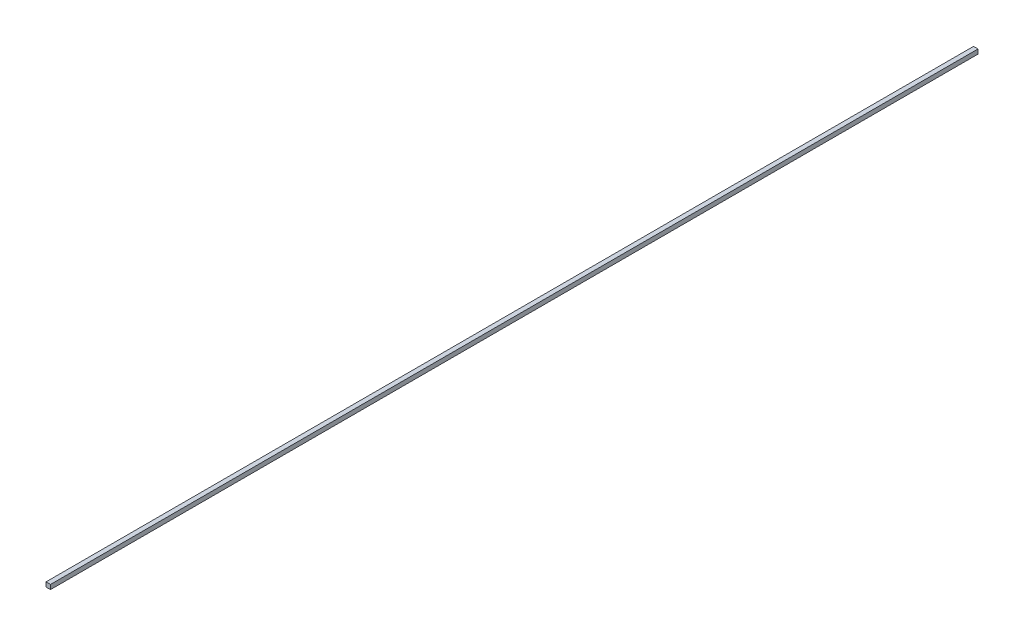
ISO-10303-21;
HEADER;
FILE_DESCRIPTION(('STEP AP214'),'2;1');
FILE_NAME('part.step','',(''),(''),'','','');
FILE_SCHEMA(('AUTOMOTIVE_DESIGN { 1 0 10303 214 1 1 1 1 }'));
ENDSEC;
DATA;
#1=APPLICATION_CONTEXT('core data for automotive mechanical design processes');
#2=APPLICATION_PROTOCOL_DEFINITION('international standard','automotive_design',2000,#1);
#3=PRODUCT_CONTEXT('',#1,'mechanical');
#4=PRODUCT('Part','Part','',(#3));
#5=PRODUCT_RELATED_PRODUCT_CATEGORY('part','',(#4));
#6=PRODUCT_DEFINITION_FORMATION('','',#4);
#7=PRODUCT_DEFINITION_CONTEXT('part definition',#1,'design');
#8=PRODUCT_DEFINITION('design','',#6,#7);
#9=PRODUCT_DEFINITION_SHAPE('','',#8);
#10=(LENGTH_UNIT() NAMED_UNIT(*) SI_UNIT(.MILLI.,.METRE.));
#11=(NAMED_UNIT(*) PLANE_ANGLE_UNIT() SI_UNIT($,.RADIAN.));
#12=(NAMED_UNIT(*) SI_UNIT($,.STERADIAN.) SOLID_ANGLE_UNIT());
#13=UNCERTAINTY_MEASURE_WITH_UNIT(LENGTH_MEASURE(1.E-05),#10,'distance_accuracy_value','');
#14=(GEOMETRIC_REPRESENTATION_CONTEXT(3) GLOBAL_UNCERTAINTY_ASSIGNED_CONTEXT((#13)) GLOBAL_UNIT_ASSIGNED_CONTEXT((#10,
#11,#12)) REPRESENTATION_CONTEXT('',''));
#15=CARTESIAN_POINT('',(0.,0.,0.));
#16=DIRECTION('',(0.,0.,1.));
#17=DIRECTION('',(1.,0.,0.));
#18=AXIS2_PLACEMENT_3D('',#15,#16,#17);
#19=CARTESIAN_POINT('',(0.,0.,5257.8));
#20=DIRECTION('',(1.,0.,0.));
#21=DIRECTION('',(0.,0.,-1.));
#22=AXIS2_PLACEMENT_3D('',#19,#20,#21);
#23=PLANE('',#22);
#24=DIRECTION('',(0.,-1.,0.));
#25=VECTOR('',#24,1.);
#26=CARTESIAN_POINT('',(0.,0.,0.));
#27=LINE('',#26,#25);
#28=CARTESIAN_POINT('',(0.,25.4,0.));
#29=VERTEX_POINT('',#28);
#30=CARTESIAN_POINT('',(0.,0.,0.));
#31=VERTEX_POINT('',#30);
#32=EDGE_CURVE('E121',#29,#31,#27,.T.);
#33=ORIENTED_EDGE('',*,*,#32,.T.);
#34=DIRECTION('',(0.,0.,-1.));
#35=VECTOR('',#34,1.);
#36=CARTESIAN_POINT('',(0.,0.,5257.8));
#37=LINE('',#36,#35);
#38=CARTESIAN_POINT('',(0.,0.,5257.8));
#39=VERTEX_POINT('',#38);
#40=EDGE_CURVE('E12',#39,#31,#37,.T.);
#41=ORIENTED_EDGE('',*,*,#40,.F.);
#42=DIRECTION('',(0.,-1.,0.));
#43=VECTOR('',#42,1.);
#44=CARTESIAN_POINT('',(0.,0.,5257.8));
#45=LINE('',#44,#43);
#46=CARTESIAN_POINT('',(0.,25.4,5257.8));
#47=VERTEX_POINT('',#46);
#48=EDGE_CURVE('E103',#47,#39,#45,.T.);
#49=ORIENTED_EDGE('',*,*,#48,.F.);
#50=DIRECTION('',(0.,0.,-1.));
#51=VECTOR('',#50,1.);
#52=CARTESIAN_POINT('',(0.,25.4,5257.8));
#53=LINE('',#52,#51);
#54=EDGE_CURVE('E116',#47,#29,#53,.T.);
#55=ORIENTED_EDGE('',*,*,#54,.T.);
#56=EDGE_LOOP('',(#33,#41,#49,#55));
#57=FACE_BOUND('',#56,.T.);
#58=ADVANCED_FACE('F55',(#57),#23,.F.);
#59=CARTESIAN_POINT('',(0.,0.,5257.8));
#60=DIRECTION('',(0.,1.,0.));
#61=DIRECTION('',(0.,0.,1.));
#62=AXIS2_PLACEMENT_3D('',#59,#60,#61);
#63=PLANE('',#62);
#64=DIRECTION('',(1.,0.,0.));
#65=VECTOR('',#64,1.);
#66=CARTESIAN_POINT('',(0.,0.,0.));
#67=LINE('',#66,#65);
#68=CARTESIAN_POINT('',(25.4,0.,0.));
#69=VERTEX_POINT('',#68);
#70=EDGE_CURVE('E110',#31,#69,#67,.T.);
#71=ORIENTED_EDGE('',*,*,#70,.T.);
#72=DIRECTION('',(0.,0.,-1.));
#73=VECTOR('',#72,1.);
#74=CARTESIAN_POINT('',(25.4,0.,5257.8));
#75=LINE('',#74,#73);
#76=CARTESIAN_POINT('',(25.4,0.,5257.8));
#77=VERTEX_POINT('',#76);
#78=EDGE_CURVE('E62',#77,#69,#75,.T.);
#79=ORIENTED_EDGE('',*,*,#78,.F.);
#80=DIRECTION('',(1.,0.,0.));
#81=VECTOR('',#80,1.);
#82=CARTESIAN_POINT('',(0.,0.,5257.8));
#83=LINE('',#82,#81);
#84=EDGE_CURVE('E99',#39,#77,#83,.T.);
#85=ORIENTED_EDGE('',*,*,#84,.F.);
#86=ORIENTED_EDGE('',*,*,#40,.T.);
#87=EDGE_LOOP('',(#71,#79,#85,#86));
#88=FACE_BOUND('',#87,.T.);
#89=ADVANCED_FACE('F108',(#88),#63,.F.);
#90=CARTESIAN_POINT('',(25.4,0.,5257.8));
#91=DIRECTION('',(-1.,0.,0.));
#92=DIRECTION('',(0.,0.,1.));
#93=AXIS2_PLACEMENT_3D('',#90,#91,#92);
#94=PLANE('',#93);
#95=DIRECTION('',(0.,1.,0.));
#96=VECTOR('',#95,1.);
#97=CARTESIAN_POINT('',(25.4,0.,0.));
#98=LINE('',#97,#96);
#99=CARTESIAN_POINT('',(25.4,25.4,0.));
#100=VERTEX_POINT('',#99);
#101=EDGE_CURVE('E90',#69,#100,#98,.T.);
#102=ORIENTED_EDGE('',*,*,#101,.T.);
#103=DIRECTION('',(0.,0.,-1.));
#104=VECTOR('',#103,1.);
#105=CARTESIAN_POINT('',(25.4,25.4,5257.8));
#106=LINE('',#105,#104);
#107=CARTESIAN_POINT('',(25.4,25.4,5257.8));
#108=VERTEX_POINT('',#107);
#109=EDGE_CURVE('E115',#108,#100,#106,.T.);
#110=ORIENTED_EDGE('',*,*,#109,.F.);
#111=DIRECTION('',(0.,1.,0.));
#112=VECTOR('',#111,1.);
#113=CARTESIAN_POINT('',(25.4,0.,5257.8));
#114=LINE('',#113,#112);
#115=EDGE_CURVE('E104',#77,#108,#114,.T.);
#116=ORIENTED_EDGE('',*,*,#115,.F.);
#117=ORIENTED_EDGE('',*,*,#78,.T.);
#118=EDGE_LOOP('',(#102,#110,#116,#117));
#119=FACE_BOUND('',#118,.T.);
#120=ADVANCED_FACE('F111',(#119),#94,.F.);
#121=CARTESIAN_POINT('',(0.,25.4,5257.8));
#122=DIRECTION('',(0.,-1.,0.));
#123=DIRECTION('',(0.,0.,-1.));
#124=AXIS2_PLACEMENT_3D('',#121,#122,#123);
#125=PLANE('',#124);
#126=DIRECTION('',(-1.,0.,0.));
#127=VECTOR('',#126,1.);
#128=CARTESIAN_POINT('',(0.,25.4,0.));
#129=LINE('',#128,#127);
#130=EDGE_CURVE('E93',#100,#29,#129,.T.);
#131=ORIENTED_EDGE('',*,*,#130,.T.);
#132=ORIENTED_EDGE('',*,*,#54,.F.);
#133=DIRECTION('',(-1.,0.,0.));
#134=VECTOR('',#133,1.);
#135=CARTESIAN_POINT('',(0.,25.4,5257.8));
#136=LINE('',#135,#134);
#137=EDGE_CURVE('E68',#108,#47,#136,.T.);
#138=ORIENTED_EDGE('',*,*,#137,.F.);
#139=ORIENTED_EDGE('',*,*,#109,.T.);
#140=EDGE_LOOP('',(#131,#132,#138,#139));
#141=FACE_BOUND('',#140,.T.);
#142=ADVANCED_FACE('F137',(#141),#125,.F.);
#143=CARTESIAN_POINT('',(0.,0.,5257.8));
#144=DIRECTION('',(0.,0.,-1.));
#145=DIRECTION('',(-1.,0.,0.));
#146=AXIS2_PLACEMENT_3D('',#143,#144,#145);
#147=PLANE('',#146);
#148=ORIENTED_EDGE('',*,*,#48,.T.);
#149=ORIENTED_EDGE('',*,*,#84,.T.);
#150=ORIENTED_EDGE('',*,*,#115,.T.);
#151=ORIENTED_EDGE('',*,*,#137,.T.);
#152=EDGE_LOOP('',(#148,#149,#150,#151));
#153=FACE_BOUND('',#152,.T.);
#154=ADVANCED_FACE('F102',(#153),#147,.F.);
#155=CARTESIAN_POINT('',(0.,0.,0.));
#156=DIRECTION('',(0.,0.,-1.));
#157=DIRECTION('',(-1.,0.,0.));
#158=AXIS2_PLACEMENT_3D('',#155,#156,#157);
#159=PLANE('',#158);
#160=ORIENTED_EDGE('',*,*,#32,.F.);
#161=ORIENTED_EDGE('',*,*,#130,.F.);
#162=ORIENTED_EDGE('',*,*,#101,.F.);
#163=ORIENTED_EDGE('',*,*,#70,.F.);
#164=EDGE_LOOP('',(#160,#161,#162,#163));
#165=FACE_BOUND('',#164,.T.);
#166=ADVANCED_FACE('F145',(#165),#159,.T.);
#167=CLOSED_SHELL('',(#58,#89,#120,#142,#154,#166));
#168=MANIFOLD_SOLID_BREP('B2',#167);
#169=ADVANCED_BREP_SHAPE_REPRESENTATION('',(#18,#168),#14);
#170=SHAPE_DEFINITION_REPRESENTATION(#9,#169);
ENDSEC;
END-ISO-10303-21;
